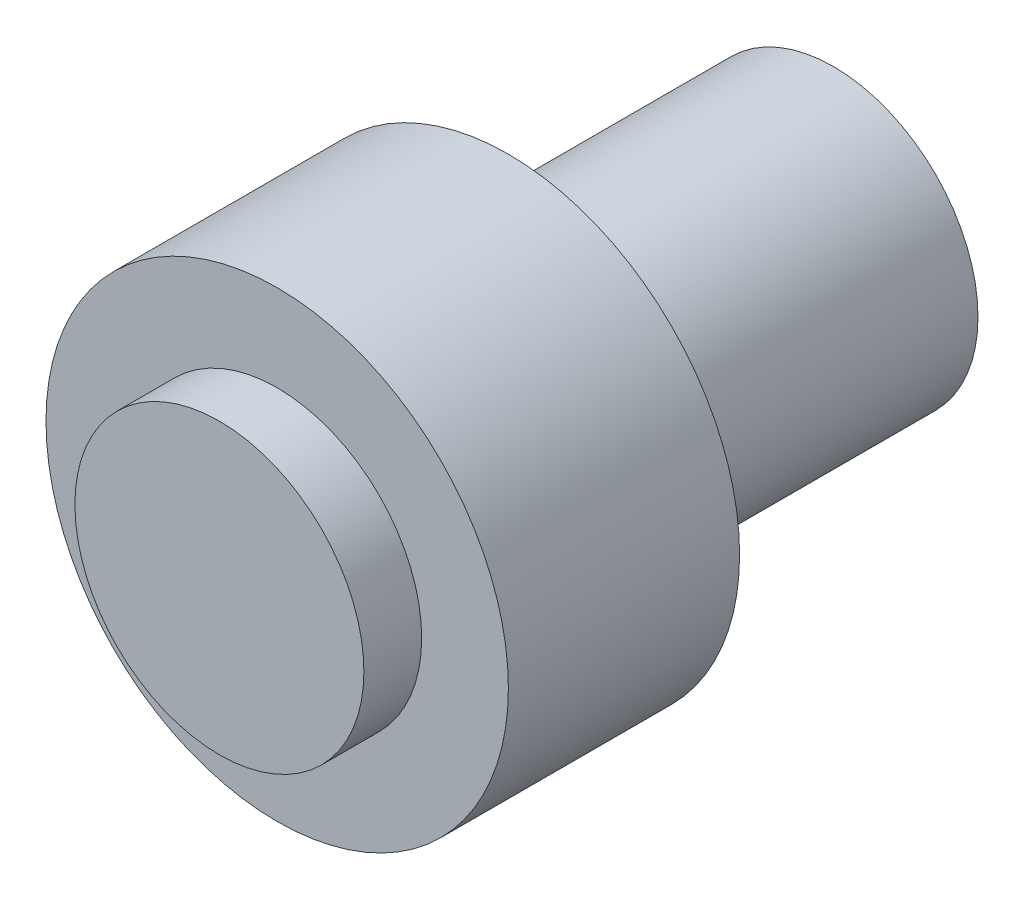
ISO-10303-21;
HEADER;
FILE_DESCRIPTION(('STEP AP214'),'2;1');
FILE_NAME('part.step','',(''),(''),'','','');
FILE_SCHEMA(('AUTOMOTIVE_DESIGN { 1 0 10303 214 1 1 1 1 }'));
ENDSEC;
DATA;
#1=APPLICATION_CONTEXT('core data for automotive mechanical design processes');
#2=APPLICATION_PROTOCOL_DEFINITION('international standard','automotive_design',2000,#1);
#3=PRODUCT_CONTEXT('',#1,'mechanical');
#4=PRODUCT('Part','Part','',(#3));
#5=PRODUCT_RELATED_PRODUCT_CATEGORY('part','',(#4));
#6=PRODUCT_DEFINITION_FORMATION('','',#4);
#7=PRODUCT_DEFINITION_CONTEXT('part definition',#1,'design');
#8=PRODUCT_DEFINITION('design','',#6,#7);
#9=PRODUCT_DEFINITION_SHAPE('','',#8);
#10=(LENGTH_UNIT() NAMED_UNIT(*) SI_UNIT(.MILLI.,.METRE.));
#11=(NAMED_UNIT(*) PLANE_ANGLE_UNIT() SI_UNIT($,.RADIAN.));
#12=(NAMED_UNIT(*) SI_UNIT($,.STERADIAN.) SOLID_ANGLE_UNIT());
#13=UNCERTAINTY_MEASURE_WITH_UNIT(LENGTH_MEASURE(1.E-05),#10,'distance_accuracy_value','');
#14=(GEOMETRIC_REPRESENTATION_CONTEXT(3) GLOBAL_UNCERTAINTY_ASSIGNED_CONTEXT((#13)) GLOBAL_UNIT_ASSIGNED_CONTEXT((#10,
#11,#12)) REPRESENTATION_CONTEXT('',''));
#15=CARTESIAN_POINT('',(0.,0.,0.));
#16=DIRECTION('',(0.,0.,1.));
#17=DIRECTION('',(1.,0.,0.));
#18=AXIS2_PLACEMENT_3D('',#15,#16,#17);
#19=CARTESIAN_POINT('',(0.,0.,0.));
#20=DIRECTION('',(0.,0.,1.));
#21=DIRECTION('',(1.,0.,0.));
#22=AXIS2_PLACEMENT_3D('',#19,#20,#21);
#23=CYLINDRICAL_SURFACE('',#22,10.16);
#24=CARTESIAN_POINT('',(0.,0.,-12.7));
#25=DIRECTION('',(0.,0.,1.));
#26=DIRECTION('',(1.,0.,0.));
#27=AXIS2_PLACEMENT_3D('',#24,#25,#26);
#28=CIRCLE('',#27,10.16);
#29=CARTESIAN_POINT('',(10.16,0.,-12.7));
#30=VERTEX_POINT('',#29);
#31=EDGE_CURVE('E10',#30,#30,#28,.T.);
#32=ORIENTED_EDGE('',*,*,#31,.T.);
#33=EDGE_LOOP('',(#32));
#34=FACE_BOUND('',#33,.T.);
#35=CARTESIAN_POINT('',(0.,0.,-2.54));
#36=DIRECTION('',(0.,0.,1.));
#37=DIRECTION('',(1.,0.,0.));
#38=AXIS2_PLACEMENT_3D('',#35,#36,#37);
#39=CIRCLE('',#38,10.16);
#40=CARTESIAN_POINT('',(10.16,0.,-2.54));
#41=VERTEX_POINT('',#40);
#42=EDGE_CURVE('E35',#41,#41,#39,.T.);
#43=ORIENTED_EDGE('',*,*,#42,.F.);
#44=EDGE_LOOP('',(#43));
#45=FACE_BOUND('',#44,.T.);
#46=ADVANCED_FACE('F31',(#34,#45),#23,.T.);
#47=CARTESIAN_POINT('',(0.,10.16,-12.7));
#48=DIRECTION('',(0.,0.,1.));
#49=DIRECTION('',(1.,0.,0.));
#50=AXIS2_PLACEMENT_3D('',#47,#48,#49);
#51=PLANE('',#50);
#52=ORIENTED_EDGE('',*,*,#31,.F.);
#53=EDGE_LOOP('',(#52));
#54=FACE_BOUND('',#53,.T.);
#55=CARTESIAN_POINT('',(0.,0.,-12.7));
#56=DIRECTION('',(0.,0.,1.));
#57=DIRECTION('',(1.,0.,0.));
#58=AXIS2_PLACEMENT_3D('',#55,#56,#57);
#59=CIRCLE('',#58,6.35);
#60=CARTESIAN_POINT('',(6.35,0.,-12.7));
#61=VERTEX_POINT('',#60);
#62=EDGE_CURVE('E39',#61,#61,#59,.T.);
#63=ORIENTED_EDGE('',*,*,#62,.T.);
#64=EDGE_LOOP('',(#63));
#65=FACE_BOUND('',#64,.T.);
#66=ADVANCED_FACE('F61',(#54,#65),#51,.F.);
#67=CARTESIAN_POINT('',(0.,0.,0.));
#68=DIRECTION('',(0.,0.,1.));
#69=DIRECTION('',(1.,0.,0.));
#70=AXIS2_PLACEMENT_3D('',#67,#68,#69);
#71=CYLINDRICAL_SURFACE('',#70,6.35);
#72=ORIENTED_EDGE('',*,*,#62,.F.);
#73=EDGE_LOOP('',(#72));
#74=FACE_BOUND('',#73,.T.);
#75=CARTESIAN_POINT('',(0.,0.,-26.9875));
#76=DIRECTION('',(0.,0.,1.));
#77=DIRECTION('',(1.,0.,0.));
#78=AXIS2_PLACEMENT_3D('',#75,#76,#77);
#79=CIRCLE('',#78,6.35);
#80=CARTESIAN_POINT('',(6.35,0.,-26.9875));
#81=VERTEX_POINT('',#80);
#82=EDGE_CURVE('E43',#81,#81,#79,.T.);
#83=ORIENTED_EDGE('',*,*,#82,.T.);
#84=EDGE_LOOP('',(#83));
#85=FACE_BOUND('',#84,.T.);
#86=ADVANCED_FACE('F65',(#74,#85),#71,.T.);
#87=CARTESIAN_POINT('',(0.,6.35,-26.9875));
#88=DIRECTION('',(0.,0.,1.));
#89=DIRECTION('',(1.,0.,0.));
#90=AXIS2_PLACEMENT_3D('',#87,#88,#89);
#91=PLANE('',#90);
#92=ORIENTED_EDGE('',*,*,#82,.F.);
#93=EDGE_LOOP('',(#92));
#94=FACE_BOUND('',#93,.T.);
#95=ADVANCED_FACE('F71',(#94),#91,.F.);
#96=CARTESIAN_POINT('',(0.,0.,-2.54));
#97=DIRECTION('',(0.,0.,1.));
#98=DIRECTION('',(1.,0.,0.));
#99=AXIS2_PLACEMENT_3D('',#96,#97,#98);
#100=PLANE('',#99);
#101=CARTESIAN_POINT('',(0.,0.,-2.54));
#102=DIRECTION('',(0.,0.,1.));
#103=DIRECTION('',(1.,0.,0.));
#104=AXIS2_PLACEMENT_3D('',#101,#102,#103);
#105=CIRCLE('',#104,6.35);
#106=CARTESIAN_POINT('',(6.35,0.,-2.54));
#107=VERTEX_POINT('',#106);
#108=EDGE_CURVE('E51',#107,#107,#105,.T.);
#109=ORIENTED_EDGE('',*,*,#108,.F.);
#110=EDGE_LOOP('',(#109));
#111=FACE_BOUND('',#110,.T.);
#112=ORIENTED_EDGE('',*,*,#42,.T.);
#113=EDGE_LOOP('',(#112));
#114=FACE_BOUND('',#113,.T.);
#115=ADVANCED_FACE('F58',(#111,#114),#100,.T.);
#116=CARTESIAN_POINT('',(0.,0.,-2.54));
#117=DIRECTION('',(0.,0.,1.));
#118=DIRECTION('',(1.,0.,0.));
#119=AXIS2_PLACEMENT_3D('',#116,#117,#118);
#120=CYLINDRICAL_SURFACE('',#119,6.35);
#121=ORIENTED_EDGE('',*,*,#108,.T.);
#122=EDGE_LOOP('',(#121));
#123=FACE_BOUND('',#122,.T.);
#124=CARTESIAN_POINT('',(0.,0.,0.));
#125=DIRECTION('',(0.,0.,1.));
#126=DIRECTION('',(1.,0.,0.));
#127=AXIS2_PLACEMENT_3D('',#124,#125,#126);
#128=CIRCLE('',#127,6.35);
#129=CARTESIAN_POINT('',(6.35,0.,0.));
#130=VERTEX_POINT('',#129);
#131=EDGE_CURVE('E48',#130,#130,#128,.T.);
#132=ORIENTED_EDGE('',*,*,#131,.F.);
#133=EDGE_LOOP('',(#132));
#134=FACE_BOUND('',#133,.T.);
#135=ADVANCED_FACE('F78',(#123,#134),#120,.T.);
#136=CARTESIAN_POINT('',(0.,0.,0.));
#137=DIRECTION('',(0.,0.,-1.));
#138=DIRECTION('',(-1.,0.,0.));
#139=AXIS2_PLACEMENT_3D('',#136,#137,#138);
#140=PLANE('',#139);
#141=ORIENTED_EDGE('',*,*,#131,.T.);
#142=EDGE_LOOP('',(#141));
#143=FACE_BOUND('',#142,.T.);
#144=ADVANCED_FACE('F33',(#143),#140,.F.);
#145=CLOSED_SHELL('',(#46,#66,#86,#95,#115,#135,#144));
#146=MANIFOLD_SOLID_BREP('B2',#145);
#147=ADVANCED_BREP_SHAPE_REPRESENTATION('',(#18,#146),#14);
#148=SHAPE_DEFINITION_REPRESENTATION(#9,#147);
ENDSEC;
END-ISO-10303-21;
